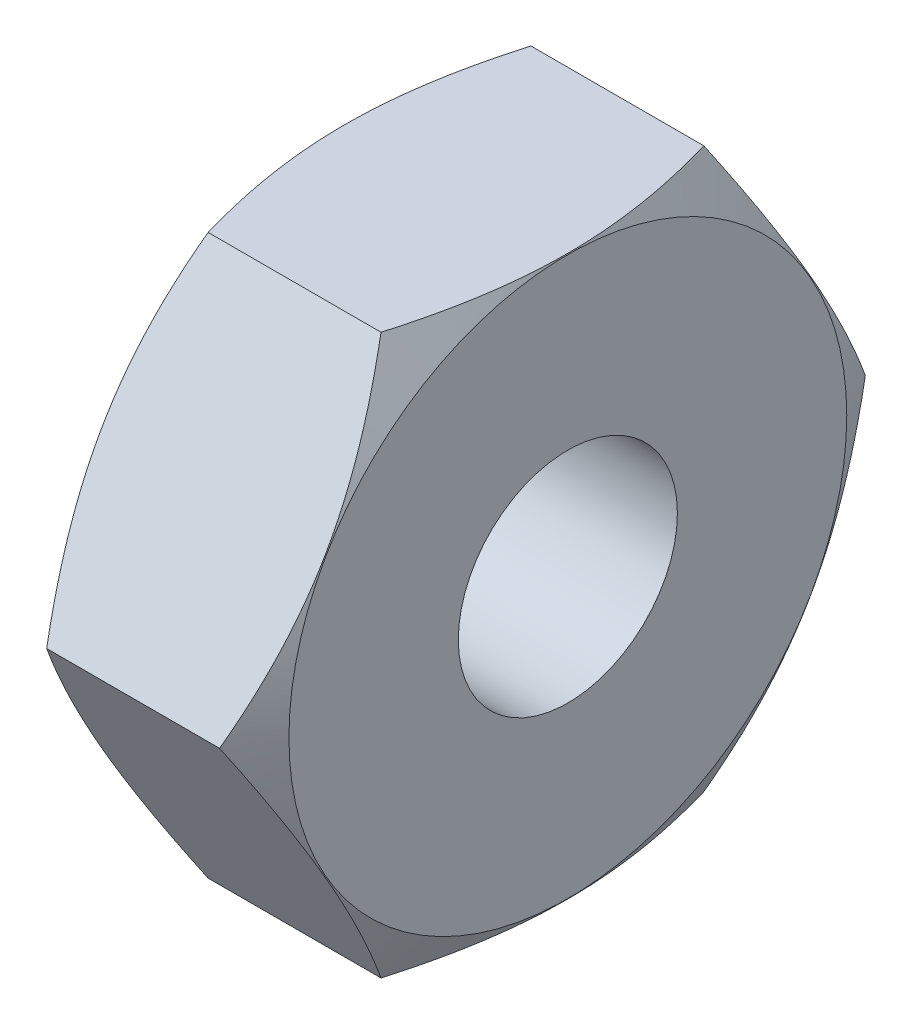
ISO-10303-21;
HEADER;
FILE_DESCRIPTION(('STEP AP214'),'2;1');
FILE_NAME('part.step','',(''),(''),'','','');
FILE_SCHEMA(('AUTOMOTIVE_DESIGN { 1 0 10303 214 1 1 1 1 }'));
ENDSEC;
DATA;
#1=APPLICATION_CONTEXT('core data for automotive mechanical design processes');
#2=APPLICATION_PROTOCOL_DEFINITION('international standard','automotive_design',2000,#1);
#3=PRODUCT_CONTEXT('',#1,'mechanical');
#4=PRODUCT('Part','Part','',(#3));
#5=PRODUCT_RELATED_PRODUCT_CATEGORY('part','',(#4));
#6=PRODUCT_DEFINITION_FORMATION('','',#4);
#7=PRODUCT_DEFINITION_CONTEXT('part definition',#1,'design');
#8=PRODUCT_DEFINITION('design','',#6,#7);
#9=PRODUCT_DEFINITION_SHAPE('','',#8);
#10=(LENGTH_UNIT() NAMED_UNIT(*) SI_UNIT(.MILLI.,.METRE.));
#11=(NAMED_UNIT(*) PLANE_ANGLE_UNIT() SI_UNIT($,.RADIAN.));
#12=(NAMED_UNIT(*) SI_UNIT($,.STERADIAN.) SOLID_ANGLE_UNIT());
#13=UNCERTAINTY_MEASURE_WITH_UNIT(LENGTH_MEASURE(1.E-05),#10,'distance_accuracy_value','');
#14=(GEOMETRIC_REPRESENTATION_CONTEXT(3) GLOBAL_UNCERTAINTY_ASSIGNED_CONTEXT((#13)) GLOBAL_UNIT_ASSIGNED_CONTEXT((#10,
#11,#12)) REPRESENTATION_CONTEXT('',''));
#15=CARTESIAN_POINT('',(0.,0.,0.));
#16=DIRECTION('',(0.,0.,1.));
#17=DIRECTION('',(1.,0.,0.));
#18=AXIS2_PLACEMENT_3D('',#15,#16,#17);
#19=CARTESIAN_POINT('',(1.41739857849643,0.,0.));
#20=DIRECTION('',(-1.,0.,0.));
#21=DIRECTION('',(0.,0.,1.));
#22=AXIS2_PLACEMENT_3D('',#19,#20,#21);
#23=CONICAL_SURFACE('',#22,2.31128740836269,1.04719755116547);
#24=CARTESIAN_POINT('',(1.59999999999627,0.,0.));
#25=DIRECTION('',(-1.,0.,0.));
#26=DIRECTION('',(0.,0.,1.));
#27=AXIS2_PLACEMENT_3D('',#24,#25,#26);
#28=CIRCLE('',#27,1.9950124688134);
#29=CARTESIAN_POINT('',(1.59999999999627,0.,1.9950124688134));
#30=VERTEX_POINT('',#29);
#31=EDGE_CURVE('E154',#30,#30,#28,.F.);
#32=ORIENTED_EDGE('',*,*,#31,.F.);
#33=EDGE_LOOP('',(#32));
#34=FACE_BOUND('',#33,.T.);
#35=CARTESIAN_POINT('',(1.41848765255554,-1.03519610526346E-12,-2.30940107675924));
#36=CARTESIAN_POINT('',(1.44474197048015,-0.0787608858918346,-2.26392845808855));
#37=CARTESIAN_POINT('',(1.46886945231972,-0.158113486347659,-2.21811421285446));
#38=CARTESIAN_POINT('',(1.51180594959973,-0.318055578813229,-2.12577160271466));
#39=CARTESIAN_POINT('',(1.53060380284501,-0.398647299476479,-2.07924195109526));
#40=CARTESIAN_POINT('',(1.56135004667021,-0.558979167159459,-1.98667430412877));
#41=CARTESIAN_POINT('',(1.57344224457168,-0.638698038270351,-1.94064859243338));
#42=CARTESIAN_POINT('',(1.59053269412577,-0.798634986606114,-1.84830895225831));
#43=CARTESIAN_POINT('',(1.595538001613,-0.878852487328967,-1.80199535662223));
#44=CARTESIAN_POINT('',(1.59816409800644,-1.0460304890429,-1.70547509233006));
#45=CARTESIAN_POINT('',(1.59513906038893,-1.13299929412495,-1.65526362930481));
#46=CARTESIAN_POINT('',(1.58059014905721,-1.30648922248561,-1.55509917246404));
#47=CARTESIAN_POINT('',(1.5690563153327,-1.39300970135137,-1.50514655070046));
#48=CARTESIAN_POINT('',(1.53811698286642,-1.56714369206201,-1.40461024428855));
#49=CARTESIAN_POINT('',(1.51852393946296,-1.65473135062742,-1.3540414860381));
#50=CARTESIAN_POINT('',(1.47294146651307,-1.82844764415579,-1.25374633720682));
#51=CARTESIAN_POINT('',(1.44696702872589,-1.91457920019216,-1.20401826014348));
#52=CARTESIAN_POINT('',(1.41848765255608,-1.99999999999902,-1.15470053838057));
#53=B_SPLINE_CURVE_WITH_KNOTS('',3,(#35,#36,#37,#38,#39,#40,#41,#42,#43,#44,#45,#46,#47,#48,#49,
#50,#51,#52),.UNSPECIFIED.,.F.,.F.,(4,2,2,2,2,2,2,2,4),(0.,0.284051933161517,0.568694453209225,
0.846969917776316,1.12496813103312,1.42598706031945,1.72735890890736,2.03618088336469,
2.34428416845465),.UNSPECIFIED.);
#54=CARTESIAN_POINT('',(1.41848765255533,6.38967405511275E-13,-2.3094010767596));
#55=VERTEX_POINT('',#54);
#56=CARTESIAN_POINT('',(1.41848765255608,-1.99999999999951,-1.15470053837972));
#57=VERTEX_POINT('',#56);
#58=EDGE_CURVE('E161',#55,#57,#53,.T.);
#59=ORIENTED_EDGE('',*,*,#58,.F.);
#60=CARTESIAN_POINT('',(1.41848765255601,1.99999999999907,-1.1547005383807));
#61=CARTESIAN_POINT('',(1.44779210743161,1.91211211243548,-1.20544263392408));
#62=CARTESIAN_POINT('',(1.47444297546009,1.82346557787664,-1.25662273451437));
#63=CARTESIAN_POINT('',(1.52096126516359,1.64463765331017,-1.3598690849015));
#64=CARTESIAN_POINT('',(1.54081223222724,1.55445308691073,-1.41193716858899));
#65=CARTESIAN_POINT('',(1.57171169362134,1.37520156623484,-1.51542808230392));
#66=CARTESIAN_POINT('',(1.58296586497118,1.28616218437656,-1.5668349933883));
#67=CARTESIAN_POINT('',(1.59639848443813,1.10766467952951,-1.66989057586148));
#68=CARTESIAN_POINT('',(1.59858805859422,1.01820720488545,-1.72153887292827));
#69=CARTESIAN_POINT('',(1.59402136241261,0.851065510281134,-1.81803817530093));
#70=CARTESIAN_POINT('',(1.58838636735052,0.773356209347929,-1.86290366111328));
#71=CARTESIAN_POINT('',(1.57053035184708,0.618443858228885,-1.9523423487327));
#72=CARTESIAN_POINT('',(1.55830323779566,0.54124134344359,-1.99691524142613));
#73=CARTESIAN_POINT('',(1.52773781922387,0.386009858271849,-2.08653818117679));
#74=CARTESIAN_POINT('',(1.50927001034268,0.308000524613708,-2.13157689096364));
#75=CARTESIAN_POINT('',(1.46735589171901,0.153145029994239,-2.22098275246773));
#76=CARTESIAN_POINT('',(1.44391942380475,0.0762968866854077,-2.26535104869383));
#77=CARTESIAN_POINT('',(1.4184876525555,1.19684249907555E-12,-2.30940107675931));
#78=B_SPLINE_CURVE_WITH_KNOTS('',3,(#60,#61,#62,#63,#64,#65,#66,#67,#68,#69,#70,#71,#72,#73,#74,
#75,#76,#77),.UNSPECIFIED.,.F.,.F.,(4,2,2,2,2,2,2,2,4),(0.,0.317016011560635,0.634793817034809,
0.944707606163314,1.25424088891083,1.52370778264196,1.79342419380156,2.06912162249362,
2.34427797351763),.UNSPECIFIED.);
#79=CARTESIAN_POINT('',(1.41848765255604,1.99999999999954,-1.15470053837981));
#80=VERTEX_POINT('',#79);
#81=EDGE_CURVE('E102',#80,#55,#78,.T.);
#82=ORIENTED_EDGE('',*,*,#81,.F.);
#83=CARTESIAN_POINT('',(1.41848765255608,2.,1.15470053837887));
#84=CARTESIAN_POINT('',(1.44779210743171,2.,1.05321634729217));
#85=CARTESIAN_POINT('',(1.47444297546024,2.,0.950856146111627));
#86=CARTESIAN_POINT('',(1.52096126516382,2.,0.744363445337492));
#87=CARTESIAN_POINT('',(1.54081223222753,2.,0.640227277962557));
#88=CARTESIAN_POINT('',(1.57171169362172,2.,0.433245450532807));
#89=CARTESIAN_POINT('',(1.58296586497161,2.,0.330431628364104));
#90=CARTESIAN_POINT('',(1.59639848443867,2.,0.12432046341785));
#91=CARTESIAN_POINT('',(1.59858805859481,2.,0.0210238692843031));
#92=CARTESIAN_POINT('',(1.59402136241329,2.,-0.171974735461064));
#93=CARTESIAN_POINT('',(1.58838636735123,2.,-0.261705707085855));
#94=CARTESIAN_POINT('',(1.57053035184782,2.,-0.440583082324897));
#95=CARTESIAN_POINT('',(1.5583032377964,2.,-0.529728867711854));
#96=CARTESIAN_POINT('',(1.5277378192246,2.,-0.708974747213366));
#97=CARTESIAN_POINT('',(1.50927001034339,2.,-0.799052166787176));
#98=CARTESIAN_POINT('',(1.46735589171966,2.,-0.977863889795556));
#99=CARTESIAN_POINT('',(1.44391942380536,2.,-1.06660048224785));
#100=CARTESIAN_POINT('',(1.41848765255606,2.,-1.15470053837891));
#101=B_SPLINE_CURVE_WITH_KNOTS('',3,(#83,#84,#85,#86,#87,#88,#89,#90,#91,#92,#93,#94,#95,#96,
#97,#98,#99,#100),.UNSPECIFIED.,.F.,.F.,(4,2,2,2,2,2,2,2,4),(0.,0.317016011560618,
0.634793817034777,0.944707606163257,1.25424088891075,1.52370778264227,1.79342419380226,
2.06912162249473,2.34427797351916),.UNSPECIFIED.);
#102=CARTESIAN_POINT('',(1.41848765255591,1.99999999999951,1.15470053838028));
#103=VERTEX_POINT('',#102);
#104=EDGE_CURVE('E146',#103,#80,#101,.T.);
#105=ORIENTED_EDGE('',*,*,#104,.F.);
#106=CARTESIAN_POINT('',(1.41848765255555,1.04861821109574E-12,2.30940107675923));
#107=CARTESIAN_POINT('',(1.44474197041605,0.0787608856998474,2.26392845819939));
#108=CARTESIAN_POINT('',(1.46886945220193,0.158113485960445,2.21811421307802));
#109=CARTESIAN_POINT('',(1.51180594940318,0.318055578029451,2.12577160316718));
#110=CARTESIAN_POINT('',(1.53060380262349,0.398647298491344,2.07924195166403));
#111=CARTESIAN_POINT('',(1.56135004643688,0.558979165776747,1.98667430492708));
#112=CARTESIAN_POINT('',(1.57344224435035,0.638698036691549,1.9406485933449));
#113=CARTESIAN_POINT('',(1.59053269396777,0.79863498463597,1.84830895339577));
#114=CARTESIAN_POINT('',(1.59553800150625,0.878852485163575,1.80199535787242));
#115=CARTESIAN_POINT('',(1.59816409805104,1.04603048687544,1.70547509358144));
#116=CARTESIAN_POINT('',(1.59513906049649,1.13299929215162,1.65526363044411));
#117=CARTESIAN_POINT('',(1.58059014924805,1.30648922090266,1.55509917337796));
#118=CARTESIAN_POINT('',(1.56905631554378,1.39300969996465,1.50514655150108));
#119=CARTESIAN_POINT('',(1.53811698307824,1.56714369107385,1.40461024485907));
#120=CARTESIAN_POINT('',(1.5185239396539,1.65473134984143,1.35404148649189));
#121=CARTESIAN_POINT('',(1.47294146663017,1.8284476437678,1.25374633743083));
#122=CARTESIAN_POINT('',(1.44696702879014,1.91457919999998,1.20401826025443));
#123=CARTESIAN_POINT('',(1.41848765255608,1.99999999999902,1.15470053838057));
#124=B_SPLINE_CURVE_WITH_KNOTS('',3,(#106,#107,#108,#109,#110,#111,#112,#113,#114,#115,#116,
#117,#118,#119,#120,#121,#122,#123),.UNSPECIFIED.,.F.,.F.,(4,2,2,2,2,2,2,2,4),(0.,
0.284051932468297,0.568694451818947,0.846969915719392,1.12496812831173,1.42598705826156,
1.72735890751513,2.03618088267013,2.34428416845428),.UNSPECIFIED.);
#125=CARTESIAN_POINT('',(1.41848765255533,-6.31886397095969E-13,2.3094010767596));
#126=VERTEX_POINT('',#125);
#127=EDGE_CURVE('E95',#126,#103,#124,.T.);
#128=ORIENTED_EDGE('',*,*,#127,.F.);
#129=CARTESIAN_POINT('',(1.41848765255601,-1.99999999999907,1.1547005383807));
#130=CARTESIAN_POINT('',(1.44779210743161,-1.91211211243548,1.20544263392408));
#131=CARTESIAN_POINT('',(1.47444297546009,-1.82346557787664,1.25662273451438));
#132=CARTESIAN_POINT('',(1.52096126516359,-1.64463765331017,1.3598690849015));
#133=CARTESIAN_POINT('',(1.54081223222724,-1.55445308691073,1.41193716858899));
#134=CARTESIAN_POINT('',(1.57171169362134,-1.37520156623484,1.51542808230392));
#135=CARTESIAN_POINT('',(1.58296586497118,-1.28616218437656,1.5668349933883));
#136=CARTESIAN_POINT('',(1.59639848443813,-1.10766467952951,1.66989057586148));
#137=CARTESIAN_POINT('',(1.59858805859422,-1.01820720488545,1.72153887292827));
#138=CARTESIAN_POINT('',(1.59402136241261,-0.851065510281133,1.81803817530093));
#139=CARTESIAN_POINT('',(1.58838636735052,-0.773356209347927,1.86290366111328));
#140=CARTESIAN_POINT('',(1.57053035184708,-0.618443858228881,1.9523423487327));
#141=CARTESIAN_POINT('',(1.55830323779565,-0.541241343443584,1.99691524142613));
#142=CARTESIAN_POINT('',(1.52773781922387,-0.386009858271841,2.08653818117679));
#143=CARTESIAN_POINT('',(1.50927001034268,-0.3080005246137,2.13157689096365));
#144=CARTESIAN_POINT('',(1.46735589171901,-0.153145029994228,2.22098275246774));
#145=CARTESIAN_POINT('',(1.44391942380475,-0.0762968866853959,2.26535104869384));
#146=CARTESIAN_POINT('',(1.4184876525555,-1.1838440527685E-12,2.30940107675932));
#147=B_SPLINE_CURVE_WITH_KNOTS('',3,(#129,#130,#131,#132,#133,#134,#135,#136,#137,#138,#139,
#140,#141,#142,#143,#144,#145,#146),.UNSPECIFIED.,.F.,.F.,(4,2,2,2,2,2,2,2,4),(0.,
0.317016011560636,0.634793817034809,0.944707606163314,1.25424088891083,1.52370778264197,
1.79342419380157,2.06912162249363,2.34427797351765),.UNSPECIFIED.);
#148=CARTESIAN_POINT('',(1.41848765255604,-1.99999999999954,1.15470053837981));
#149=VERTEX_POINT('',#148);
#150=EDGE_CURVE('E21',#149,#126,#147,.T.);
#151=ORIENTED_EDGE('',*,*,#150,.F.);
#152=CARTESIAN_POINT('',(1.41848765255608,-2.,-1.15470053837887));
#153=CARTESIAN_POINT('',(1.44779210743171,-2.,-1.05321634729217));
#154=CARTESIAN_POINT('',(1.47444297546024,-2.,-0.950856146111627));
#155=CARTESIAN_POINT('',(1.52096126516382,-2.,-0.744363445337492));
#156=CARTESIAN_POINT('',(1.54081223222752,-2.,-0.640227277962558));
#157=CARTESIAN_POINT('',(1.57171169362172,-2.,-0.433245450532807));
#158=CARTESIAN_POINT('',(1.58296586497161,-2.,-0.330431628364104));
#159=CARTESIAN_POINT('',(1.59639848443867,-2.,-0.12432046341785));
#160=CARTESIAN_POINT('',(1.59858805859481,-2.,-0.0210238692843032));
#161=CARTESIAN_POINT('',(1.59402136241329,-2.,0.171974735461064));
#162=CARTESIAN_POINT('',(1.58838636735123,-2.,0.261705707085855));
#163=CARTESIAN_POINT('',(1.57053035184782,-2.,0.440583082324897));
#164=CARTESIAN_POINT('',(1.5583032377964,-2.,0.529728867711854));
#165=CARTESIAN_POINT('',(1.5277378192246,-2.,0.708974747213366));
#166=CARTESIAN_POINT('',(1.50927001034339,-2.,0.799052166787176));
#167=CARTESIAN_POINT('',(1.46735589171966,-2.,0.977863889795556));
#168=CARTESIAN_POINT('',(1.44391942380536,-2.,1.06660048224785));
#169=CARTESIAN_POINT('',(1.41848765255606,-2.,1.15470053837891));
#170=B_SPLINE_CURVE_WITH_KNOTS('',3,(#152,#153,#154,#155,#156,#157,#158,#159,#160,#161,#162,
#163,#164,#165,#166,#167,#168,#169),.UNSPECIFIED.,.F.,.F.,(4,2,2,2,2,2,2,2,4),(0.,
0.317016011560618,0.634793817034777,0.944707606163257,1.25424088891075,1.52370778264227,
1.79342419380226,2.06912162249473,2.34427797351916),.UNSPECIFIED.);
#171=EDGE_CURVE('E83',#57,#149,#170,.T.);
#172=ORIENTED_EDGE('',*,*,#171,.F.);
#173=EDGE_LOOP('',(#59,#82,#105,#128,#151,#172));
#174=FACE_BOUND('',#173,.T.);
#175=ADVANCED_FACE('F17',(#34,#174),#23,.T.);
#176=CARTESIAN_POINT('',(0.,0.,2.30940107676));
#177=DIRECTION('',(0.,-0.50000000000019,0.866025403784329));
#178=DIRECTION('',(0.,-0.866025403784329,-0.50000000000019));
#179=AXIS2_PLACEMENT_3D('',#176,#177,#178);
#180=PLANE('',#179);
#181=ORIENTED_EDGE('',*,*,#150,.T.);
#182=DIRECTION('',(1.,0.,0.));
#183=VECTOR('',#182,1.);
#184=CARTESIAN_POINT('',(0.,0.,2.30940107675988));
#185=LINE('',#184,#183);
#186=CARTESIAN_POINT('',(0.181512334939412,-3.75054339883807E-08,2.30940105510619));
#187=VERTEX_POINT('',#186);
#188=EDGE_CURVE('E160',#187,#126,#185,.T.);
#189=ORIENTED_EDGE('',*,*,#188,.F.);
#190=CARTESIAN_POINT('',(0.181512322431846,-1.99999992497361,1.15470058169667));
#191=CARTESIAN_POINT('',(0.152207869612488,-1.91211203867661,1.20544267650878));
#192=CARTESIAN_POINT('',(0.125557003767776,-1.82346550539261,1.25662277636305));
#193=CARTESIAN_POINT('',(0.0790387185960024,-1.64463758350133,1.35986912520565));
#194=CARTESIAN_POINT('',(0.0591877538774403,-1.55445301850304,1.41193720808419));
#195=CARTESIAN_POINT('',(0.0282882971186009,-1.37520150057395,1.51542812021325));
#196=CARTESIAN_POINT('',(0.017034128073114,-1.28616212005574,1.56683503052395));
#197=CARTESIAN_POINT('',(0.00360151305925519,-1.10766461804396,1.66989061136018));
#198=CARTESIAN_POINT('',(0.00141194105380545,-1.0182071448948,1.72153890756389));
#199=CARTESIAN_POINT('',(0.00597864063320577,-0.851065462969802,1.81803820261614));
#200=CARTESIAN_POINT('',(0.0116136361107066,-0.773356173181893,1.86290368199375));
#201=CARTESIAN_POINT('',(0.0294696504854278,-0.618443844263942,1.95234235679537));
#202=CARTESIAN_POINT('',(0.0416967629882527,-0.541241340534088,1.99691524310593));
#203=CARTESIAN_POINT('',(0.0722621767266225,-0.386009877789335,2.08653816990836));
#204=CARTESIAN_POINT('',(0.0907299822608373,-0.30800055549292,2.13157687313552));
#205=CARTESIAN_POINT('',(0.132644092918978,-0.153145083211293,2.22098272174285));
#206=CARTESIAN_POINT('',(0.156080556221002,-0.0762969508799376,2.2653510116311));
#207=CARTESIAN_POINT('',(0.181512322437648,-7.5010787646501E-08,2.3094010334525));
#208=B_SPLINE_CURVE_WITH_KNOTS('',3,(#190,#191,#192,#193,#194,#195,#196,#197,#198,#199,#200,
#201,#202,#203,#204,#205,#206,#207),.UNSPECIFIED.,.F.,.F.,(4,2,2,2,2,2,2,2,4),(0.,
0.317016005625579,0.63479380500213,0.944707588763364,1.25424086620841,1.52370772160828,
1.79342409429213,2.06912148247214,2.34427779327138),.UNSPECIFIED.);
#209=CARTESIAN_POINT('',(0.181512352245658,-2.,1.15470055502523));
#210=VERTEX_POINT('',#209);
#211=EDGE_CURVE('E101',#210,#187,#208,.T.);
#212=ORIENTED_EDGE('',*,*,#211,.F.);
#213=DIRECTION('',(1.,0.,0.));
#214=VECTOR('',#213,1.);
#215=CARTESIAN_POINT('',(0.,-2.,1.15470053838));
#216=LINE('',#215,#214);
#217=EDGE_CURVE('E88',#149,#210,#216,.F.);
#218=ORIENTED_EDGE('',*,*,#217,.F.);
#219=EDGE_LOOP('',(#181,#189,#212,#218));
#220=FACE_BOUND('',#219,.T.);
#221=ADVANCED_FACE('F100',(#220),#180,.T.);
#222=CARTESIAN_POINT('',(0.,-2.,1.15470053838));
#223=DIRECTION('',(0.,-1.,0.));
#224=DIRECTION('',(0.,0.,-1.));
#225=AXIS2_PLACEMENT_3D('',#222,#223,#224);
#226=PLANE('',#225);
#227=ORIENTED_EDGE('',*,*,#171,.T.);
#228=ORIENTED_EDGE('',*,*,#217,.T.);
#229=CARTESIAN_POINT('',(0.181512357058322,-2.,-1.15470057169678));
#230=CARTESIAN_POINT('',(0.152207901394857,-2.,-1.05321638004845));
#231=CARTESIAN_POINT('',(0.125557032529198,-2.,-0.950856178302776));
#232=CARTESIAN_POINT('',(0.0790387410874914,-2.,-0.74436347634301));
#233=CARTESIAN_POINT('',(0.0591877731238857,-2.,-0.640227308347215));
#234=CARTESIAN_POINT('',(0.0282883099498734,-2.,-0.433245479700123));
#235=CARTESIAN_POINT('',(0.0170341377146844,-2.,-0.330431656937407));
#236=CARTESIAN_POINT('',(0.00360151653579776,-2.,-0.124320490734291));
#237=CARTESIAN_POINT('',(0.00141194155241383,-2.,-0.0210238959380331));
#238=CARTESIAN_POINT('',(0.00597863642594144,-2.,0.171974714436362));
#239=CARTESIAN_POINT('',(0.0116136313273044,-2.,0.261705691010092));
#240=CARTESIAN_POINT('',(0.0294696472622845,-2.,0.440583076107402));
#241=CARTESIAN_POINT('',(0.0416967619077,-2.,0.529728866403531));
#242=CARTESIAN_POINT('',(0.0722621823346148,-2.,0.708974755863579));
#243=CARTESIAN_POINT('',(0.0907299925008241,-2.,0.799052180482401));
#244=CARTESIAN_POINT('',(0.132644114183175,-2.,0.97786391340983));
#245=CARTESIAN_POINT('',(0.156080583868674,-2.,1.06660051073677));
#246=CARTESIAN_POINT('',(0.181512357050721,-2.,1.15470057167046));
#247=B_SPLINE_CURVE_WITH_KNOTS('',3,(#229,#230,#231,#232,#233,#234,#235,#236,#237,#238,#239,
#240,#241,#242,#243,#244,#245,#246),.UNSPECIFIED.,.F.,.F.,(4,2,2,2,2,2,2,2,4),(0.,
0.317016013838252,0.63479382165238,0.944707612841594,1.254240897625,1.52370780609661,
1.7934242320522,2.0691216763222,2.34427804281381),.UNSPECIFIED.);
#248=CARTESIAN_POINT('',(0.181512334932384,-1.99999996247537,-1.15470056004486));
#249=VERTEX_POINT('',#248);
#250=EDGE_CURVE('E191',#249,#210,#247,.T.);
#251=ORIENTED_EDGE('',*,*,#250,.F.);
#252=DIRECTION('',(1.,0.,0.));
#253=VECTOR('',#252,1.);
#254=CARTESIAN_POINT('',(0.,-2.,-1.15470053838));
#255=LINE('',#254,#253);
#256=EDGE_CURVE('E90',#57,#249,#255,.F.);
#257=ORIENTED_EDGE('',*,*,#256,.F.);
#258=EDGE_LOOP('',(#227,#228,#251,#257));
#259=FACE_BOUND('',#258,.T.);
#260=ADVANCED_FACE('F85',(#259),#226,.T.);
#261=CARTESIAN_POINT('',(0.,0.,-2.30940107676));
#262=DIRECTION('',(0.,0.50000000000019,-0.866025403784329));
#263=DIRECTION('',(0.,0.866025403784329,0.50000000000019));
#264=AXIS2_PLACEMENT_3D('',#261,#262,#263);
#265=PLANE('',#264);
#266=ORIENTED_EDGE('',*,*,#81,.T.);
#267=DIRECTION('',(1.,0.,0.));
#268=VECTOR('',#267,1.);
#269=CARTESIAN_POINT('',(0.,0.,-2.30940107675988));
#270=LINE('',#269,#268);
#271=CARTESIAN_POINT('',(0.181512343574381,1.15359803746138E-08,-2.30940107009966));
#272=VERTEX_POINT('',#271);
#273=EDGE_CURVE('E105',#272,#55,#270,.T.);
#274=ORIENTED_EDGE('',*,*,#273,.F.);
#275=CARTESIAN_POINT('',(0.181512322411948,1.99999992497846,-1.15470058169387));
#276=CARTESIAN_POINT('',(0.152207869591831,1.9121120386657,-1.20544267651508));
#277=CARTESIAN_POINT('',(0.125557003746884,1.82346550536598,-1.25662277637842));
#278=CARTESIAN_POINT('',(0.0790387185757676,1.64463758344109,-1.35986912524043));
#279=CARTESIAN_POINT('',(0.0591877538582618,1.55445301842489,-1.41193720812931));
#280=CARTESIAN_POINT('',(0.0282882971104053,1.37520150049619,-1.51542812025814));
#281=CARTESIAN_POINT('',(0.0170341280715222,1.28616211999673,-1.56683503055801));
#282=CARTESIAN_POINT('',(0.00360151306495119,1.10766461802569,-1.66989061137072));
#283=CARTESIAN_POINT('',(0.00141194106002967,1.01820714489852,-1.72153890756174));
#284=CARTESIAN_POINT('',(0.00597864075810276,0.851065458605047,-1.81803820513613));
#285=CARTESIAN_POINT('',(0.011613636751624,0.773356164436112,-1.86290368704313));
#286=CARTESIAN_POINT('',(0.0294696528695404,0.61844382682872,-1.9523423668616));
#287=CARTESIAN_POINT('',(0.0416967666012247,0.541241318790623,-1.99691525565953));
#288=CARTESIAN_POINT('',(0.0722621834040391,0.386009847329909,-2.08653818749412));
#289=CARTESIAN_POINT('',(0.0907299907960221,0.308000520630041,-2.13157689326361));
#290=CARTESIAN_POINT('',(0.132644105573906,0.153145039701367,-2.22098274686331));
#291=CARTESIAN_POINT('',(0.156080571135449,0.0762969031258399,-2.26535103920194));
#292=CARTESIAN_POINT('',(0.181512339729102,2.30718789227311E-08,-2.30940106343944));
#293=B_SPLINE_CURVE_WITH_KNOTS('',3,(#275,#276,#277,#278,#279,#280,#281,#282,#283,#284,#285,
#286,#287,#288,#289,#290,#291,#292),.UNSPECIFIED.,.F.,.F.,(4,2,2,2,2,2,2,2,4),(0.,
0.317016005678485,0.634793805115438,0.944707588809502,1.25424086618187,1.52370773677937,
1.79342412471697,2.069121528941,2.3442778556623),.UNSPECIFIED.);
#294=CARTESIAN_POINT('',(0.18151235222499,2.,-1.15470055502816));
#295=VERTEX_POINT('',#294);
#296=EDGE_CURVE('E255',#295,#272,#293,.T.);
#297=ORIENTED_EDGE('',*,*,#296,.F.);
#298=DIRECTION('',(1.,0.,0.));
#299=VECTOR('',#298,1.);
#300=CARTESIAN_POINT('',(0.,2.,-1.15470053838));
#301=LINE('',#300,#299);
#302=EDGE_CURVE('E152',#80,#295,#301,.F.);
#303=ORIENTED_EDGE('',*,*,#302,.F.);
#304=EDGE_LOOP('',(#266,#274,#297,#303));
#305=FACE_BOUND('',#304,.T.);
#306=ADVANCED_FACE('F172',(#305),#265,.T.);
#307=CARTESIAN_POINT('',(0.,-2.,-1.15470053838));
#308=DIRECTION('',(0.,-0.50000000000019,-0.866025403784329));
#309=DIRECTION('',(0.,0.866025403784329,-0.50000000000019));
#310=AXIS2_PLACEMENT_3D('',#307,#308,#309);
#311=PLANE('',#310);
#312=ORIENTED_EDGE('',*,*,#58,.T.);
#313=ORIENTED_EDGE('',*,*,#256,.T.);
#314=CARTESIAN_POINT('',(0.00320115475173715,-0.959118132318422,-1.75565396488086));
#315=CARTESIAN_POINT('',(0.00249891506893928,-1.00328466769465,-1.73015440379221));
#316=CARTESIAN_POINT('',(0.00293753066270403,-1.04745852716082,-1.70465061413826));
#317=CARTESIAN_POINT('',(0.00604873794408852,-1.13573837342102,-1.65368222113589));
#318=CARTESIAN_POINT('',(0.00872086915930491,-1.17984437232794,-1.62821761079409));
#319=CARTESIAN_POINT('',(0.0199733136745609,-1.31146196428156,-1.55222815864954));
#320=CARTESIAN_POINT('',(0.031782899619546,-1.39877837269849,-1.50181600674533));
#321=CARTESIAN_POINT('',(0.062987373624783,-1.57223031428151,-1.40167348158085));
#322=CARTESIAN_POINT('',(0.0823729107621544,-1.65836716822086,-1.3519423457718));
#323=CARTESIAN_POINT('',(0.127499663358969,-1.82990359174575,-1.25290574547383));
#324=CARTESIAN_POINT('',(0.153275901480641,-1.91529632052723,-1.20360423052498));
#325=CARTESIAN_POINT('',(0.181512322424174,-1.99999992495073,-1.15470058170971));
#326=B_SPLINE_CURVE_WITH_KNOTS('',3,(#314,#315,#316,#317,#318,#319,#320,#321,#322,#323,#324,
#325),.UNSPECIFIED.,.F.,.F.,(4,2,2,2,2,4),(0.,0.152985804574839,0.305940076632112,
0.610104386280562,0.913894448614701,1.21938765520872),.UNSPECIFIED.);
#327=CARTESIAN_POINT('',(0.00320115475476756,-0.959118132318458,-1.75565396488084));
#328=VERTEX_POINT('',#327);
#329=EDGE_CURVE('E184',#328,#249,#326,.T.);
#330=ORIENTED_EDGE('',*,*,#329,.F.);
#331=CARTESIAN_POINT('',(0.181512339729052,-2.30717442718127E-08,-2.30940106343936));
#332=CARTESIAN_POINT('',(0.155471998453177,-0.0781253673083347,-2.26429537491381));
#333=CARTESIAN_POINT('',(0.131523124137506,-0.156826172944607,-2.21885744359424));
#334=CARTESIAN_POINT('',(0.0889900403720188,-0.314920509578474,-2.12758163578128));
#335=CARTESIAN_POINT('',(0.0703818703413997,-0.394309246455929,-2.08174652717443));
#336=CARTESIAN_POINT('',(0.0394394189887068,-0.554115256305745,-1.98948248436947));
#337=CARTESIAN_POINT('',(0.0271114292302382,-0.634533478296844,-1.94305300225514));
#338=CARTESIAN_POINT('',(0.0139965220830752,-0.755770569321938,-1.873056735116));
#339=CARTESIAN_POINT('',(0.0105192916524814,-0.796379658061786,-1.84961106680049));
#340=CARTESIAN_POINT('',(0.00543914840712555,-0.87769295595966,-1.80266481237043));
#341=CARTESIAN_POINT('',(0.00383658573758105,-0.918397181464952,-1.77916421681778));
#342=CARTESIAN_POINT('',(0.00320115475779838,-0.959118132318494,-1.75565396488082));
#343=B_SPLINE_CURVE_WITH_KNOTS('',3,(#331,#332,#333,#334,#335,#336,#337,#338,#339,#340,#341,
#342),.UNSPECIFIED.,.F.,.F.,(4,2,2,2,2,4),(0.,0.281743826044928,0.56220313607596,
0.842942863943248,0.983969817871489,1.12502310821738),.UNSPECIFIED.);
#344=EDGE_CURVE('E178',#272,#328,#343,.T.);
#345=ORIENTED_EDGE('',*,*,#344,.F.);
#346=ORIENTED_EDGE('',*,*,#273,.T.);
#347=EDGE_LOOP('',(#312,#313,#330,#345,#346));
#348=FACE_BOUND('',#347,.T.);
#349=ADVANCED_FACE('F169',(#348),#311,.T.);
#350=CARTESIAN_POINT('',(0.,2.,1.15470053838));
#351=DIRECTION('',(0.,0.50000000000019,0.866025403784329));
#352=DIRECTION('',(0.,-0.866025403784329,0.50000000000019));
#353=AXIS2_PLACEMENT_3D('',#350,#351,#352);
#354=PLANE('',#353);
#355=ORIENTED_EDGE('',*,*,#127,.T.);
#356=DIRECTION('',(1.,0.,0.));
#357=VECTOR('',#356,1.);
#358=CARTESIAN_POINT('',(0.,2.,1.15470053838));
#359=LINE('',#358,#357);
#360=CARTESIAN_POINT('',(0.18151233491151,1.99999996247729,1.15470056004375));
#361=VERTEX_POINT('',#360);
#362=EDGE_CURVE('E153',#361,#103,#359,.T.);
#363=ORIENTED_EDGE('',*,*,#362,.F.);
#364=CARTESIAN_POINT('',(0.00320115475799562,0.959118132305946,1.75565396488807));
#365=CARTESIAN_POINT('',(0.00249891507508781,1.00328466768263,1.73015440379915));
#366=CARTESIAN_POINT('',(0.00293753066858769,1.04745852714924,1.70465061414495));
#367=CARTESIAN_POINT('',(0.00604873794914752,1.13573837341038,1.65368222114204));
#368=CARTESIAN_POINT('',(0.00872086916380433,1.17984437231777,1.62821761079996));
#369=CARTESIAN_POINT('',(0.0199733136769806,1.31146196427301,1.55222815865448));
#370=CARTESIAN_POINT('',(0.0317828996200448,1.39877837269115,1.50181600674957));
#371=CARTESIAN_POINT('',(0.0629873736205951,1.57223031427692,1.40167348158351));
#372=CARTESIAN_POINT('',(0.0823729107552044,1.6583671682178,1.35194234577357));
#373=CARTESIAN_POINT('',(0.127499663345826,1.82990359174596,1.25290574547371));
#374=CARTESIAN_POINT('',(0.153275901464054,1.91529632052917,1.20360423052386));
#375=CARTESIAN_POINT('',(0.18151232240394,1.99999992495458,1.15470058170749));
#376=B_SPLINE_CURVE_WITH_KNOTS('',3,(#364,#365,#366,#367,#368,#369,#370,#371,#372,#373,#374,
#375),.UNSPECIFIED.,.F.,.F.,(4,2,2,2,2,4),(0.,0.152985804576405,0.305940076635255,
0.610104386287291,0.913894448625113,1.21938765522239),.UNSPECIFIED.);
#377=CARTESIAN_POINT('',(0.00320115472484859,0.959118132303097,1.75565396486173));
#378=VERTEX_POINT('',#377);
#379=EDGE_CURVE('E125',#378,#361,#376,.T.);
#380=ORIENTED_EDGE('',*,*,#379,.F.);
#381=CARTESIAN_POINT('',(0.181512357045846,-2.88140925989135E-08,2.30940109339566));
#382=CARTESIAN_POINT('',(0.155472013391939,0.0781253195209945,2.26429540250384));
#383=CARTESIAN_POINT('',(0.131523136811294,0.156826129314631,2.21885746878402));
#384=CARTESIAN_POINT('',(0.0889900489412172,0.314920474342527,2.12758165612476));
#385=CARTESIAN_POINT('',(0.0703818770672549,0.394309215455696,2.08174654507242));
#386=CARTESIAN_POINT('',(0.0394394226032294,0.554115233928689,1.98948249728887));
#387=CARTESIAN_POINT('',(0.0271114315784196,0.634533460307545,1.94305301264127));
#388=CARTESIAN_POINT('',(0.0139965230993534,0.755770558004172,1.87305674165031));
#389=CARTESIAN_POINT('',(0.0105192923191151,0.796379648995468,1.84961107203493));
#390=CARTESIAN_POINT('',(0.00543914858005752,0.877692951411459,1.80266481499634));
#391=CARTESIAN_POINT('',(0.00383658576656732,0.918397179183425,1.77916421813502));
#392=CARTESIAN_POINT('',(0.0032011547519344,0.959118132305875,1.75565396488811));
#393=B_SPLINE_CURVE_WITH_KNOTS('',3,(#381,#382,#383,#384,#385,#386,#387,#388,#389,#390,#391,
#392),.UNSPECIFIED.,.F.,.F.,(4,2,2,2,2,4),(0.,0.281743841679275,0.562203167172986,
0.842942910566022,0.983969872344147,1.12502317054689),.UNSPECIFIED.);
#394=EDGE_CURVE('E192',#187,#378,#393,.T.);
#395=ORIENTED_EDGE('',*,*,#394,.F.);
#396=ORIENTED_EDGE('',*,*,#188,.T.);
#397=EDGE_LOOP('',(#355,#363,#380,#395,#396));
#398=FACE_BOUND('',#397,.T.);
#399=ADVANCED_FACE('F140',(#398),#354,.T.);
#400=CARTESIAN_POINT('',(0.,2.,-1.15470053838));
#401=DIRECTION('',(0.,1.,0.));
#402=DIRECTION('',(0.,0.,1.));
#403=AXIS2_PLACEMENT_3D('',#400,#401,#402);
#404=PLANE('',#403);
#405=ORIENTED_EDGE('',*,*,#104,.T.);
#406=ORIENTED_EDGE('',*,*,#302,.T.);
#407=CARTESIAN_POINT('',(0.181512357038835,2.,1.15470057170381));
#408=CARTESIAN_POINT('',(0.152207901380133,2.,1.05321638005674));
#409=CARTESIAN_POINT('',(0.125557032518824,2.,0.950856178312618));
#410=CARTESIAN_POINT('',(0.0790387410846018,2.,0.744363476356538));
#411=CARTESIAN_POINT('',(0.0591877731241208,2.,0.640227308362881));
#412=CARTESIAN_POINT('',(0.0282883099544902,2.,0.433245479719641));
#413=CARTESIAN_POINT('',(0.017034137720662,2.,0.330431656958616));
#414=CARTESIAN_POINT('',(0.00360151654273776,2.,0.124320490758988));
#415=CARTESIAN_POINT('',(0.00141194155896167,2.,0.0210238959645245));
#416=CARTESIAN_POINT('',(0.00597863643024117,2.,-0.171974714410832));
#417=CARTESIAN_POINT('',(0.0116136313302826,2.,-0.261705690987291));
#418=CARTESIAN_POINT('',(0.0294696472620767,2.,-0.440583076090231));
#419=CARTESIAN_POINT('',(0.0416967619056253,2.,-0.52972886638926));
#420=CARTESIAN_POINT('',(0.072262182328258,2.,-0.70897475585489));
#421=CARTESIAN_POINT('',(0.0907299924920075,2.,-0.799052180476405));
#422=CARTESIAN_POINT('',(0.132644114169086,2.,-0.97786391340954));
#423=CARTESIAN_POINT('',(0.156080583851778,2.,-1.06660051073949));
#424=CARTESIAN_POINT('',(0.1815123570309,2.,-1.15470057167632));
#425=B_SPLINE_CURVE_WITH_KNOTS('',3,(#407,#408,#409,#410,#411,#412,#413,#414,#415,#416,#417,
#418,#419,#420,#421,#422,#423,#424),.UNSPECIFIED.,.F.,.F.,(4,2,2,2,2,2,2,2,4),(0.,
0.317016013830581,0.634793821636743,0.944707612820603,1.25424089759881,1.52370780607839,
1.79342423204189,2.06912167631835,2.34427804281658),.UNSPECIFIED.);
#426=EDGE_CURVE('E117',#361,#295,#425,.T.);
#427=ORIENTED_EDGE('',*,*,#426,.F.);
#428=ORIENTED_EDGE('',*,*,#362,.T.);
#429=EDGE_LOOP('',(#405,#406,#427,#428));
#430=FACE_BOUND('',#429,.T.);
#431=ADVANCED_FACE('F135',(#430),#404,.T.);
#432=CARTESIAN_POINT('',(1.6,0.,0.));
#433=DIRECTION('',(1.,0.,0.));
#434=DIRECTION('',(0.,0.,-1.));
#435=AXIS2_PLACEMENT_3D('',#432,#433,#434);
#436=PLANE('',#435);
#437=CARTESIAN_POINT('',(1.6,0.,0.));
#438=DIRECTION('',(1.,0.,0.));
#439=DIRECTION('',(0.,0.,-1.));
#440=AXIS2_PLACEMENT_3D('',#437,#438,#439);
#441=CIRCLE('',#440,0.7835);
#442=CARTESIAN_POINT('',(1.6,0.,-0.7835));
#443=VERTEX_POINT('',#442);
#444=EDGE_CURVE('E114',#443,#443,#441,.F.);
#445=ORIENTED_EDGE('',*,*,#444,.T.);
#446=EDGE_LOOP('',(#445));
#447=FACE_BOUND('',#446,.T.);
#448=ORIENTED_EDGE('',*,*,#31,.T.);
#449=EDGE_LOOP('',(#448));
#450=FACE_BOUND('',#449,.T.);
#451=ADVANCED_FACE('F139',(#447,#450),#436,.T.);
#452=CARTESIAN_POINT('',(0.182601421499839,0.,0.));
#453=DIRECTION('',(1.,0.,0.));
#454=DIRECTION('',(0.,0.,-1.));
#455=AXIS2_PLACEMENT_3D('',#452,#453,#454);
#456=CONICAL_SURFACE('',#455,2.31128740836269,1.04719755119466);
#457=ORIENTED_EDGE('',*,*,#329,.T.);
#458=ORIENTED_EDGE('',*,*,#250,.T.);
#459=ORIENTED_EDGE('',*,*,#211,.T.);
#460=ORIENTED_EDGE('',*,*,#394,.T.);
#461=DIRECTION('',(-0.499999999997054,-0.415194695655093,-0.760008792516785));
#462=VECTOR('',#461,1.);
#463=CARTESIAN_POINT('',(328284.52389114,272604.942432052,499000.));
#464=LINE('',#463,#462);
#465=CARTESIAN_POINT('',(1.55869918751564E-11,0.956459927351716,1.75078815340157));
#466=VERTEX_POINT('',#465);
#467=EDGE_CURVE('E241',#466,#378,#464,.F.);
#468=ORIENTED_EDGE('',*,*,#467,.F.);
#469=CARTESIAN_POINT('',(1.23082425328158E-11,0.,0.));
#470=DIRECTION('',(1.,0.,0.));
#471=DIRECTION('',(0.,0.,-1.));
#472=AXIS2_PLACEMENT_3D('',#469,#470,#471);
#473=CIRCLE('',#472,1.9950124688134);
#474=CARTESIAN_POINT('',(9.43287060874848E-12,-0.956459927381862,-1.7507881533851));
#475=VERTEX_POINT('',#474);
#476=EDGE_CURVE('E111',#466,#475,#473,.T.);
#477=ORIENTED_EDGE('',*,*,#476,.T.);
#478=CARTESIAN_POINT('',(0.00320115475460625,-0.959118132319064,-1.75565396488195));
#479=CARTESIAN_POINT('',(0.00306777329343941,-0.959007373796307,-1.75545122273089));
#480=CARTESIAN_POINT('',(0.00293439184300186,-0.958896615265801,-1.75524848057701));
#481=CARTESIAN_POINT('',(0.00266762896107457,-0.958675098204789,-1.75484299628819));
#482=CARTESIAN_POINT('',(0.00253424752958482,-0.958564339674283,-1.75464025415325));
#483=CARTESIAN_POINT('',(0.00226748464329724,-0.958342822595763,-1.75423476986651));
#484=CARTESIAN_POINT('',(0.0021341031884994,-0.958232064047749,-1.75403202771471));
#485=CARTESIAN_POINT('',(0.00186734028318014,-0.958010546944335,-1.75362654341233));
#486=CARTESIAN_POINT('',(0.00173395883265872,-0.957899788388935,-1.75342380126175));
#487=CARTESIAN_POINT('',(0.00146719592588103,-0.957678271315274,-1.75301831695443));
#488=CARTESIAN_POINT('',(0.00133381446962477,-0.957567512797014,-1.75281557479768));
#489=CARTESIAN_POINT('',(0.00106705156397471,-0.957345995723202,-1.7524100904897));
#490=CARTESIAN_POINT('',(0.000933670114580918,-0.957235237167651,-1.75220734833846));
#491=CARTESIAN_POINT('',(0.000666907228949766,-0.957013720083844,-1.75180186407312));
#492=CARTESIAN_POINT('',(0.000533525792712409,-0.956902961555588,-1.75159912195903));
#493=CARTESIAN_POINT('',(0.000266762901289887,-0.956681444480127,-1.75119363769295));
#494=CARTESIAN_POINT('',(0.000133381446104723,-0.956570685932924,-1.75099089554096));
#495=CARTESIAN_POINT('',(0.,-0.956459927381862,-1.7507881533851));
#496=B_SPLINE_CURVE_WITH_KNOTS('',3,(#478,#479,#480,#481,#482,#483,#484,#485,#486,#487,#488,
#489,#490,#491,#492,#493,#494,#495),.UNSPECIFIED.,.F.,.F.,(4,2,2,2,2,2,2,2,4),(0.,
0.000800288697444866,0.00160057732326655,0.00240086604431266,0.00320115476535869,
0.00400144346280372,0.00480173218384973,0.00560202076646988,0.00640230948751588),.UNSPECIFIED.);
#497=EDGE_CURVE('E39',#328,#475,#496,.T.);
#498=ORIENTED_EDGE('',*,*,#497,.F.);
#499=EDGE_LOOP('',(#457,#458,#459,#460,#468,#477,#498));
#500=FACE_BOUND('',#499,.T.);
#501=ADVANCED_FACE('F199',(#500),#456,.T.);
#502=CARTESIAN_POINT('',(0.182605163274729,0.,0.));
#503=DIRECTION('',(1.,0.,0.));
#504=DIRECTION('',(0.,0.,-1.));
#505=AXIS2_PLACEMENT_3D('',#502,#503,#504);
#506=CONICAL_SURFACE('',#505,2.31129388934446,1.04719755126163);
#507=ORIENTED_EDGE('',*,*,#379,.T.);
#508=ORIENTED_EDGE('',*,*,#426,.T.);
#509=ORIENTED_EDGE('',*,*,#296,.T.);
#510=ORIENTED_EDGE('',*,*,#344,.T.);
#511=ORIENTED_EDGE('',*,*,#497,.T.);
#512=CARTESIAN_POINT('',(1.8865741217497E-11,0.,0.));
#513=DIRECTION('',(1.,0.,0.));
#514=DIRECTION('',(0.,0.,-1.));
#515=AXIS2_PLACEMENT_3D('',#512,#513,#514);
#516=CIRCLE('',#515,1.9950124688134);
#517=EDGE_CURVE('E30',#475,#466,#516,.T.);
#518=ORIENTED_EDGE('',*,*,#517,.T.);
#519=ORIENTED_EDGE('',*,*,#467,.T.);
#520=EDGE_LOOP('',(#507,#508,#509,#510,#511,#518,#519));
#521=FACE_BOUND('',#520,.T.);
#522=ADVANCED_FACE('F131',(#521),#506,.T.);
#523=CARTESIAN_POINT('',(0.8,0.,0.));
#524=DIRECTION('',(1.,0.,0.));
#525=DIRECTION('',(0.,0.,-1.));
#526=AXIS2_PLACEMENT_3D('',#523,#524,#525);
#527=CYLINDRICAL_SURFACE('',#526,0.7835);
#528=ORIENTED_EDGE('',*,*,#444,.F.);
#529=EDGE_LOOP('',(#528));
#530=FACE_BOUND('',#529,.T.);
#531=CARTESIAN_POINT('',(0.,0.,0.));
#532=DIRECTION('',(1.,0.,0.));
#533=DIRECTION('',(0.,0.,-1.));
#534=AXIS2_PLACEMENT_3D('',#531,#532,#533);
#535=CIRCLE('',#534,0.7835);
#536=CARTESIAN_POINT('',(0.,0.,-0.7835));
#537=VERTEX_POINT('',#536);
#538=EDGE_CURVE('E11',#537,#537,#535,.F.);
#539=ORIENTED_EDGE('',*,*,#538,.T.);
#540=EDGE_LOOP('',(#539));
#541=FACE_BOUND('',#540,.T.);
#542=ADVANCED_FACE('F225',(#530,#541),#527,.F.);
#543=CARTESIAN_POINT('',(0.,0.,0.));
#544=DIRECTION('',(1.,0.,0.));
#545=DIRECTION('',(0.,0.,-1.));
#546=AXIS2_PLACEMENT_3D('',#543,#544,#545);
#547=PLANE('',#546);
#548=ORIENTED_EDGE('',*,*,#538,.F.);
#549=EDGE_LOOP('',(#548));
#550=FACE_BOUND('',#549,.T.);
#551=ORIENTED_EDGE('',*,*,#476,.F.);
#552=ORIENTED_EDGE('',*,*,#517,.F.);
#553=EDGE_LOOP('',(#551,#552));
#554=FACE_BOUND('',#553,.T.);
#555=ADVANCED_FACE('F223',(#550,#554),#547,.F.);
#556=CLOSED_SHELL('',(#175,#221,#260,#306,#349,#399,#431,#451,#501,#522,#542,#555));
#557=MANIFOLD_SOLID_BREP('B1',#556);
#558=ADVANCED_BREP_SHAPE_REPRESENTATION('',(#18,#557),#14);
#559=SHAPE_DEFINITION_REPRESENTATION(#9,#558);
ENDSEC;
END-ISO-10303-21;
